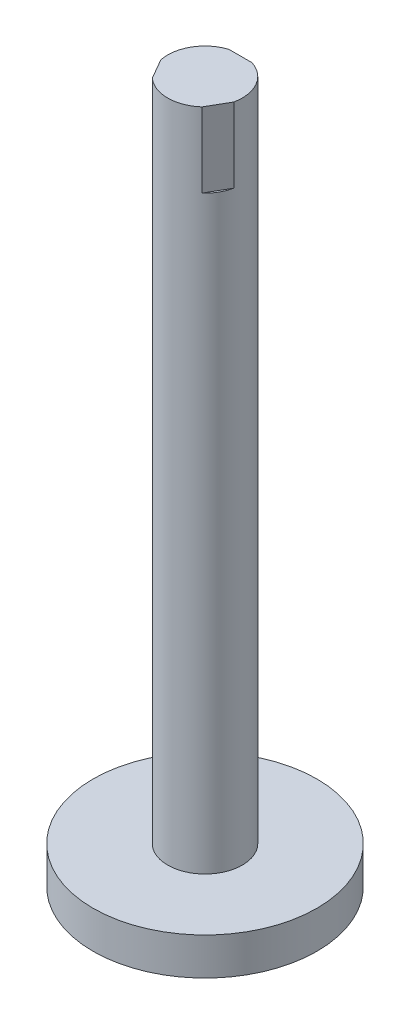
ISO-10303-21;
HEADER;
FILE_DESCRIPTION(('STEP AP214'),'2;1');
FILE_NAME('part.step','',(''),(''),'','','');
FILE_SCHEMA(('AUTOMOTIVE_DESIGN { 1 0 10303 214 1 1 1 1 }'));
ENDSEC;
DATA;
#1=APPLICATION_CONTEXT('core data for automotive mechanical design processes');
#2=APPLICATION_PROTOCOL_DEFINITION('international standard','automotive_design',2000,#1);
#3=PRODUCT_CONTEXT('',#1,'mechanical');
#4=PRODUCT('Part','Part','',(#3));
#5=PRODUCT_RELATED_PRODUCT_CATEGORY('part','',(#4));
#6=PRODUCT_DEFINITION_FORMATION('','',#4);
#7=PRODUCT_DEFINITION_CONTEXT('part definition',#1,'design');
#8=PRODUCT_DEFINITION('design','',#6,#7);
#9=PRODUCT_DEFINITION_SHAPE('','',#8);
#10=(LENGTH_UNIT() NAMED_UNIT(*) SI_UNIT(.MILLI.,.METRE.));
#11=(NAMED_UNIT(*) PLANE_ANGLE_UNIT() SI_UNIT($,.RADIAN.));
#12=(NAMED_UNIT(*) SI_UNIT($,.STERADIAN.) SOLID_ANGLE_UNIT());
#13=UNCERTAINTY_MEASURE_WITH_UNIT(LENGTH_MEASURE(1.E-05),#10,'distance_accuracy_value','');
#14=(GEOMETRIC_REPRESENTATION_CONTEXT(3) GLOBAL_UNCERTAINTY_ASSIGNED_CONTEXT((#13)) GLOBAL_UNIT_ASSIGNED_CONTEXT((#10,
#11,#12)) REPRESENTATION_CONTEXT('',''));
#15=CARTESIAN_POINT('',(0.,0.,0.));
#16=DIRECTION('',(0.,0.,1.));
#17=DIRECTION('',(1.,0.,0.));
#18=AXIS2_PLACEMENT_3D('',#15,#16,#17);
#19=CARTESIAN_POINT('',(0.,-5.,0.));
#20=DIRECTION('',(0.,1.,0.));
#21=DIRECTION('',(0.,0.,1.));
#22=AXIS2_PLACEMENT_3D('',#19,#20,#21);
#23=CYLINDRICAL_SURFACE('',#22,15.);
#24=CARTESIAN_POINT('',(0.,-5.,0.));
#25=DIRECTION('',(0.,1.,0.));
#26=DIRECTION('',(0.,0.,1.));
#27=AXIS2_PLACEMENT_3D('',#24,#25,#26);
#28=CIRCLE('',#27,15.);
#29=CARTESIAN_POINT('',(0.,-5.,15.));
#30=VERTEX_POINT('',#29);
#31=EDGE_CURVE('E49',#30,#30,#28,.T.);
#32=ORIENTED_EDGE('',*,*,#31,.T.);
#33=EDGE_LOOP('',(#32));
#34=FACE_BOUND('',#33,.T.);
#35=CARTESIAN_POINT('',(0.,0.,0.));
#36=DIRECTION('',(0.,1.,0.));
#37=DIRECTION('',(0.,0.,1.));
#38=AXIS2_PLACEMENT_3D('',#35,#36,#37);
#39=CIRCLE('',#38,15.);
#40=CARTESIAN_POINT('',(0.,0.,15.));
#41=VERTEX_POINT('',#40);
#42=EDGE_CURVE('E44',#41,#41,#39,.T.);
#43=ORIENTED_EDGE('',*,*,#42,.F.);
#44=EDGE_LOOP('',(#43));
#45=FACE_BOUND('',#44,.T.);
#46=ADVANCED_FACE('F41',(#34,#45),#23,.T.);
#47=CARTESIAN_POINT('',(0.,-5.,0.));
#48=DIRECTION('',(0.,1.,0.));
#49=DIRECTION('',(0.,0.,1.));
#50=AXIS2_PLACEMENT_3D('',#47,#48,#49);
#51=PLANE('',#50);
#52=ORIENTED_EDGE('',*,*,#31,.F.);
#53=EDGE_LOOP('',(#52));
#54=FACE_BOUND('',#53,.T.);
#55=ADVANCED_FACE('F153',(#54),#51,.F.);
#56=CARTESIAN_POINT('',(0.,0.,0.));
#57=DIRECTION('',(0.,1.,0.));
#58=DIRECTION('',(0.,0.,1.));
#59=AXIS2_PLACEMENT_3D('',#56,#57,#58);
#60=PLANE('',#59);
#61=CARTESIAN_POINT('',(0.,0.,0.));
#62=DIRECTION('',(0.,1.,0.));
#63=DIRECTION('',(0.,0.,1.));
#64=AXIS2_PLACEMENT_3D('',#61,#62,#63);
#65=CIRCLE('',#64,5.);
#66=CARTESIAN_POINT('',(0.,0.,5.));
#67=VERTEX_POINT('',#66);
#68=EDGE_CURVE('E11',#67,#67,#65,.T.);
#69=ORIENTED_EDGE('',*,*,#68,.F.);
#70=EDGE_LOOP('',(#69));
#71=FACE_BOUND('',#70,.T.);
#72=ORIENTED_EDGE('',*,*,#42,.T.);
#73=EDGE_LOOP('',(#72));
#74=FACE_BOUND('',#73,.T.);
#75=ADVANCED_FACE('F150',(#71,#74),#60,.T.);
#76=CARTESIAN_POINT('',(0.,89.,0.));
#77=DIRECTION('',(0.,-1.,0.));
#78=DIRECTION('',(0.,0.,-1.));
#79=AXIS2_PLACEMENT_3D('',#76,#77,#78);
#80=CYLINDRICAL_SURFACE('',#79,5.);
#81=CARTESIAN_POINT('',(0.,89.,0.));
#82=DIRECTION('',(0.,1.,0.));
#83=DIRECTION('',(0.,0.,1.));
#84=AXIS2_PLACEMENT_3D('',#81,#82,#83);
#85=CIRCLE('',#84,5.);
#86=CARTESIAN_POINT('',(-3.33299591817627,89.,3.72708172829901));
#87=VERTEX_POINT('',#86);
#88=CARTESIAN_POINT('',(3.33299591817632,89.,3.72708172829897));
#89=VERTEX_POINT('',#88);
#90=EDGE_CURVE('E143',#87,#89,#85,.T.);
#91=ORIENTED_EDGE('',*,*,#90,.F.);
#92=DIRECTION('',(0.,1.,0.));
#93=VECTOR('',#92,1.);
#94=CARTESIAN_POINT('',(-3.33299591817627,79.,3.72708172829901));
#95=LINE('',#94,#93);
#96=CARTESIAN_POINT('',(-3.33299591817627,79.,3.72708172829901));
#97=VERTEX_POINT('',#96);
#98=EDGE_CURVE('E65',#97,#87,#95,.T.);
#99=ORIENTED_EDGE('',*,*,#98,.F.);
#100=CARTESIAN_POINT('',(0.,79.,0.));
#101=DIRECTION('',(0.,1.,0.));
#102=DIRECTION('',(0.866025403784436,0.,-0.500000000000004));
#103=AXIS2_PLACEMENT_3D('',#100,#101,#102);
#104=CIRCLE('',#103,5.);
#105=CARTESIAN_POINT('',(-4.89424541777588,79.,1.02291827170103));
#106=VERTEX_POINT('',#105);
#107=EDGE_CURVE('E103',#106,#97,#104,.T.);
#108=ORIENTED_EDGE('',*,*,#107,.F.);
#109=DIRECTION('',(0.,1.,0.));
#110=VECTOR('',#109,1.);
#111=CARTESIAN_POINT('',(-4.89424541777588,79.,1.02291827170103));
#112=LINE('',#111,#110);
#113=CARTESIAN_POINT('',(-4.89424541777588,89.,1.02291827170103));
#114=VERTEX_POINT('',#113);
#115=EDGE_CURVE('E93',#106,#114,#112,.T.);
#116=ORIENTED_EDGE('',*,*,#115,.T.);
#117=CARTESIAN_POINT('',(-1.5612494995996,89.,-4.75));
#118=VERTEX_POINT('',#117);
#119=EDGE_CURVE('E142',#118,#114,#85,.T.);
#120=ORIENTED_EDGE('',*,*,#119,.F.);
#121=DIRECTION('',(0.,1.,0.));
#122=VECTOR('',#121,1.);
#123=CARTESIAN_POINT('',(-1.5612494995996,79.,-4.75));
#124=LINE('',#123,#122);
#125=CARTESIAN_POINT('',(-1.5612494995996,79.,-4.75));
#126=VERTEX_POINT('',#125);
#127=EDGE_CURVE('E137',#126,#118,#124,.T.);
#128=ORIENTED_EDGE('',*,*,#127,.F.);
#129=CARTESIAN_POINT('',(0.,79.,0.));
#130=DIRECTION('',(0.,1.,0.));
#131=DIRECTION('',(0.,0.,1.));
#132=AXIS2_PLACEMENT_3D('',#129,#130,#131);
#133=CIRCLE('',#132,5.);
#134=CARTESIAN_POINT('',(1.5612494995996,79.,-4.75));
#135=VERTEX_POINT('',#134);
#136=EDGE_CURVE('E131',#135,#126,#133,.T.);
#137=ORIENTED_EDGE('',*,*,#136,.F.);
#138=DIRECTION('',(0.,1.,0.));
#139=VECTOR('',#138,1.);
#140=CARTESIAN_POINT('',(1.5612494995996,79.,-4.75));
#141=LINE('',#140,#139);
#142=CARTESIAN_POINT('',(1.5612494995996,89.,-4.75));
#143=VERTEX_POINT('',#142);
#144=EDGE_CURVE('E134',#135,#143,#141,.T.);
#145=ORIENTED_EDGE('',*,*,#144,.T.);
#146=CARTESIAN_POINT('',(4.89424541777589,89.,1.02291827170096));
#147=VERTEX_POINT('',#146);
#148=EDGE_CURVE('E139',#147,#143,#85,.T.);
#149=ORIENTED_EDGE('',*,*,#148,.F.);
#150=DIRECTION('',(0.,1.,0.));
#151=VECTOR('',#150,1.);
#152=CARTESIAN_POINT('',(4.89424541777589,79.,1.02291827170096));
#153=LINE('',#152,#151);
#154=CARTESIAN_POINT('',(4.89424541777589,79.,1.02291827170096));
#155=VERTEX_POINT('',#154);
#156=EDGE_CURVE('E57',#155,#147,#153,.T.);
#157=ORIENTED_EDGE('',*,*,#156,.F.);
#158=CARTESIAN_POINT('',(0.,79.,0.));
#159=DIRECTION('',(0.,1.,0.));
#160=DIRECTION('',(-0.866025403784443,0.,-0.499999999999992));
#161=AXIS2_PLACEMENT_3D('',#158,#159,#160);
#162=CIRCLE('',#161,5.);
#163=CARTESIAN_POINT('',(3.33299591817632,79.,3.72708172829897));
#164=VERTEX_POINT('',#163);
#165=EDGE_CURVE('E119',#164,#155,#162,.T.);
#166=ORIENTED_EDGE('',*,*,#165,.F.);
#167=DIRECTION('',(0.,1.,0.));
#168=VECTOR('',#167,1.);
#169=CARTESIAN_POINT('',(3.33299591817632,79.,3.72708172829897));
#170=LINE('',#169,#168);
#171=EDGE_CURVE('E123',#164,#89,#170,.T.);
#172=ORIENTED_EDGE('',*,*,#171,.T.);
#173=EDGE_LOOP('',(#91,#99,#108,#116,#120,#128,#137,#145,#149,#157,#166,#172));
#174=FACE_BOUND('',#173,.T.);
#175=ORIENTED_EDGE('',*,*,#68,.T.);
#176=EDGE_LOOP('',(#175));
#177=FACE_BOUND('',#176,.T.);
#178=ADVANCED_FACE('F109',(#174,#177),#80,.T.);
#179=CARTESIAN_POINT('',(0.,89.,0.));
#180=DIRECTION('',(0.,1.,0.));
#181=DIRECTION('',(0.,0.,1.));
#182=AXIS2_PLACEMENT_3D('',#179,#180,#181);
#183=PLANE('',#182);
#184=DIRECTION('',(-0.500000000000004,0.,-0.866025403784436));
#185=VECTOR('',#184,1.);
#186=CARTESIAN_POINT('',(-3.33299591817627,89.,3.72708172829901));
#187=LINE('',#186,#185);
#188=EDGE_CURVE('E98',#87,#114,#187,.T.);
#189=ORIENTED_EDGE('',*,*,#188,.F.);
#190=ORIENTED_EDGE('',*,*,#90,.T.);
#191=DIRECTION('',(-0.499999999999992,0.,0.866025403784443));
#192=VECTOR('',#191,1.);
#193=CARTESIAN_POINT('',(4.89424541777589,89.,1.02291827170096));
#194=LINE('',#193,#192);
#195=EDGE_CURVE('E120',#147,#89,#194,.T.);
#196=ORIENTED_EDGE('',*,*,#195,.F.);
#197=ORIENTED_EDGE('',*,*,#148,.T.);
#198=DIRECTION('',(1.,0.,0.));
#199=VECTOR('',#198,1.);
#200=CARTESIAN_POINT('',(-1.5612494995996,89.,-4.75));
#201=LINE('',#200,#199);
#202=EDGE_CURVE('E114',#118,#143,#201,.T.);
#203=ORIENTED_EDGE('',*,*,#202,.F.);
#204=ORIENTED_EDGE('',*,*,#119,.T.);
#205=EDGE_LOOP('',(#189,#190,#196,#197,#203,#204));
#206=FACE_BOUND('',#205,.T.);
#207=ADVANCED_FACE('F166',(#206),#183,.T.);
#208=CARTESIAN_POINT('',(-1.5612494995996,79.,-4.75));
#209=DIRECTION('',(0.,0.,1.));
#210=DIRECTION('',(1.,0.,0.));
#211=AXIS2_PLACEMENT_3D('',#208,#209,#210);
#212=PLANE('',#211);
#213=ORIENTED_EDGE('',*,*,#202,.T.);
#214=ORIENTED_EDGE('',*,*,#144,.F.);
#215=DIRECTION('',(1.,0.,0.));
#216=VECTOR('',#215,1.);
#217=CARTESIAN_POINT('',(-1.5612494995996,79.,-4.75));
#218=LINE('',#217,#216);
#219=EDGE_CURVE('E128',#126,#135,#218,.T.);
#220=ORIENTED_EDGE('',*,*,#219,.F.);
#221=ORIENTED_EDGE('',*,*,#127,.T.);
#222=EDGE_LOOP('',(#213,#214,#220,#221));
#223=FACE_BOUND('',#222,.T.);
#224=ADVANCED_FACE('F169',(#223),#212,.F.);
#225=CARTESIAN_POINT('',(0.,79.,0.));
#226=DIRECTION('',(0.,1.,0.));
#227=DIRECTION('',(0.,0.,1.));
#228=AXIS2_PLACEMENT_3D('',#225,#226,#227);
#229=PLANE('',#228);
#230=ORIENTED_EDGE('',*,*,#219,.T.);
#231=ORIENTED_EDGE('',*,*,#136,.T.);
#232=EDGE_LOOP('',(#230,#231));
#233=FACE_BOUND('',#232,.T.);
#234=ADVANCED_FACE('F173',(#233),#229,.T.);
#235=CARTESIAN_POINT('',(4.89424541777589,79.,1.02291827170096));
#236=DIRECTION('',(-0.866025403784443,0.,-0.499999999999992));
#237=DIRECTION('',(-0.499999999999992,0.,0.866025403784443));
#238=AXIS2_PLACEMENT_3D('',#235,#236,#237);
#239=PLANE('',#238);
#240=ORIENTED_EDGE('',*,*,#195,.T.);
#241=ORIENTED_EDGE('',*,*,#171,.F.);
#242=DIRECTION('',(-0.499999999999992,0.,0.866025403784443));
#243=VECTOR('',#242,1.);
#244=CARTESIAN_POINT('',(4.89424541777589,79.,1.02291827170096));
#245=LINE('',#244,#243);
#246=EDGE_CURVE('E116',#155,#164,#245,.T.);
#247=ORIENTED_EDGE('',*,*,#246,.F.);
#248=ORIENTED_EDGE('',*,*,#156,.T.);
#249=EDGE_LOOP('',(#240,#241,#247,#248));
#250=FACE_BOUND('',#249,.T.);
#251=ADVANCED_FACE('F177',(#250),#239,.F.);
#252=CARTESIAN_POINT('',(0.,79.,0.));
#253=DIRECTION('',(0.,1.,0.));
#254=DIRECTION('',(-0.866025403784443,0.,-0.499999999999992));
#255=AXIS2_PLACEMENT_3D('',#252,#253,#254);
#256=PLANE('',#255);
#257=ORIENTED_EDGE('',*,*,#246,.T.);
#258=ORIENTED_EDGE('',*,*,#165,.T.);
#259=EDGE_LOOP('',(#257,#258));
#260=FACE_BOUND('',#259,.T.);
#261=ADVANCED_FACE('F181',(#260),#256,.T.);
#262=CARTESIAN_POINT('',(-3.33299591817627,79.,3.72708172829901));
#263=DIRECTION('',(0.866025403784436,0.,-0.500000000000004));
#264=DIRECTION('',(-0.500000000000004,0.,-0.866025403784436));
#265=AXIS2_PLACEMENT_3D('',#262,#263,#264);
#266=PLANE('',#265);
#267=ORIENTED_EDGE('',*,*,#188,.T.);
#268=ORIENTED_EDGE('',*,*,#115,.F.);
#269=DIRECTION('',(-0.500000000000004,0.,-0.866025403784436));
#270=VECTOR('',#269,1.);
#271=CARTESIAN_POINT('',(-3.33299591817627,79.,3.72708172829901));
#272=LINE('',#271,#270);
#273=EDGE_CURVE('E96',#97,#106,#272,.T.);
#274=ORIENTED_EDGE('',*,*,#273,.F.);
#275=ORIENTED_EDGE('',*,*,#98,.T.);
#276=EDGE_LOOP('',(#267,#268,#274,#275));
#277=FACE_BOUND('',#276,.T.);
#278=ADVANCED_FACE('F95',(#277),#266,.F.);
#279=CARTESIAN_POINT('',(0.,79.,0.));
#280=DIRECTION('',(0.,1.,0.));
#281=DIRECTION('',(0.866025403784436,0.,-0.500000000000004));
#282=AXIS2_PLACEMENT_3D('',#279,#280,#281);
#283=PLANE('',#282);
#284=ORIENTED_EDGE('',*,*,#273,.T.);
#285=ORIENTED_EDGE('',*,*,#107,.T.);
#286=EDGE_LOOP('',(#284,#285));
#287=FACE_BOUND('',#286,.T.);
#288=ADVANCED_FACE('F106',(#287),#283,.T.);
#289=CLOSED_SHELL('',(#46,#55,#75,#178,#207,#224,#234,#251,#261,#278,#288));
#290=MANIFOLD_SOLID_BREP('B2',#289);
#291=ADVANCED_BREP_SHAPE_REPRESENTATION('',(#18,#290),#14);
#292=SHAPE_DEFINITION_REPRESENTATION(#9,#291);
ENDSEC;
END-ISO-10303-21;
